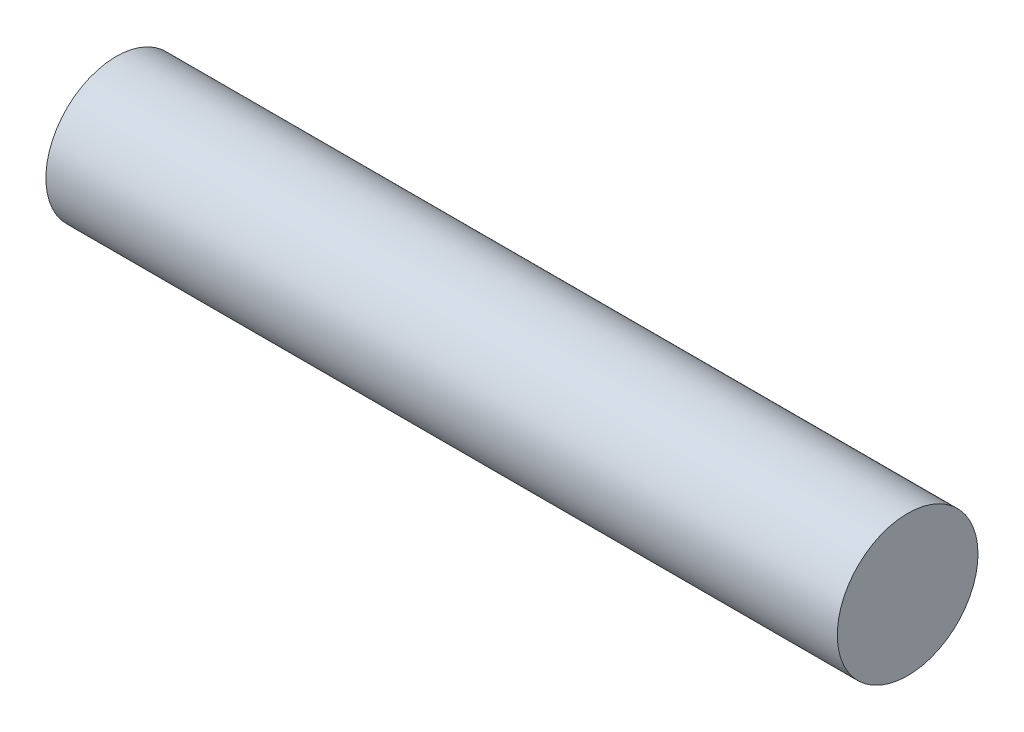
ISO-10303-21;
HEADER;
FILE_DESCRIPTION(('STEP AP214'),'2;1');
FILE_NAME('part.step','',(''),(''),'','','');
FILE_SCHEMA(('AUTOMOTIVE_DESIGN { 1 0 10303 214 1 1 1 1 }'));
ENDSEC;
DATA;
#1=APPLICATION_CONTEXT('core data for automotive mechanical design processes');
#2=APPLICATION_PROTOCOL_DEFINITION('international standard','automotive_design',2000,#1);
#3=PRODUCT_CONTEXT('',#1,'mechanical');
#4=PRODUCT('Part','Part','',(#3));
#5=PRODUCT_RELATED_PRODUCT_CATEGORY('part','',(#4));
#6=PRODUCT_DEFINITION_FORMATION('','',#4);
#7=PRODUCT_DEFINITION_CONTEXT('part definition',#1,'design');
#8=PRODUCT_DEFINITION('design','',#6,#7);
#9=PRODUCT_DEFINITION_SHAPE('','',#8);
#10=(LENGTH_UNIT() NAMED_UNIT(*) SI_UNIT(.MILLI.,.METRE.));
#11=(NAMED_UNIT(*) PLANE_ANGLE_UNIT() SI_UNIT($,.RADIAN.));
#12=(NAMED_UNIT(*) SI_UNIT($,.STERADIAN.) SOLID_ANGLE_UNIT());
#13=UNCERTAINTY_MEASURE_WITH_UNIT(LENGTH_MEASURE(1.E-05),#10,'distance_accuracy_value','');
#14=(GEOMETRIC_REPRESENTATION_CONTEXT(3) GLOBAL_UNCERTAINTY_ASSIGNED_CONTEXT((#13)) GLOBAL_UNIT_ASSIGNED_CONTEXT((#10,
#11,#12)) REPRESENTATION_CONTEXT('',''));
#15=CARTESIAN_POINT('',(0.,0.,0.));
#16=DIRECTION('',(0.,0.,1.));
#17=DIRECTION('',(1.,0.,0.));
#18=AXIS2_PLACEMENT_3D('',#15,#16,#17);
#19=CARTESIAN_POINT('',(9.,0.,0.));
#20=DIRECTION('',(-1.,0.,0.));
#21=DIRECTION('',(0.,0.,1.));
#22=AXIS2_PLACEMENT_3D('',#19,#20,#21);
#23=CYLINDRICAL_SURFACE('',#22,0.8);
#24=CARTESIAN_POINT('',(9.,0.,0.));
#25=DIRECTION('',(1.,0.,0.));
#26=DIRECTION('',(0.,0.,-1.));
#27=AXIS2_PLACEMENT_3D('',#24,#25,#26);
#28=CIRCLE('',#27,0.8);
#29=CARTESIAN_POINT('',(9.,0.,-0.8));
#30=VERTEX_POINT('',#29);
#31=EDGE_CURVE('E10',#30,#30,#28,.T.);
#32=ORIENTED_EDGE('',*,*,#31,.F.);
#33=EDGE_LOOP('',(#32));
#34=FACE_BOUND('',#33,.T.);
#35=CARTESIAN_POINT('',(0.,0.,0.));
#36=DIRECTION('',(1.,0.,0.));
#37=DIRECTION('',(0.,0.,-1.));
#38=AXIS2_PLACEMENT_3D('',#35,#36,#37);
#39=CIRCLE('',#38,0.8);
#40=CARTESIAN_POINT('',(0.,0.,-0.8));
#41=VERTEX_POINT('',#40);
#42=EDGE_CURVE('E43',#41,#41,#39,.T.);
#43=ORIENTED_EDGE('',*,*,#42,.T.);
#44=EDGE_LOOP('',(#43));
#45=FACE_BOUND('',#44,.T.);
#46=ADVANCED_FACE('F40',(#34,#45),#23,.T.);
#47=CARTESIAN_POINT('',(9.,0.,0.));
#48=DIRECTION('',(1.,0.,0.));
#49=DIRECTION('',(0.,0.,-1.));
#50=AXIS2_PLACEMENT_3D('',#47,#48,#49);
#51=PLANE('',#50);
#52=ORIENTED_EDGE('',*,*,#31,.T.);
#53=EDGE_LOOP('',(#52));
#54=FACE_BOUND('',#53,.T.);
#55=ADVANCED_FACE('F55',(#54),#51,.T.);
#56=CARTESIAN_POINT('',(0.,0.,0.));
#57=DIRECTION('',(1.,0.,0.));
#58=DIRECTION('',(0.,0.,-1.));
#59=AXIS2_PLACEMENT_3D('',#56,#57,#58);
#60=PLANE('',#59);
#61=ORIENTED_EDGE('',*,*,#42,.F.);
#62=EDGE_LOOP('',(#61));
#63=FACE_BOUND('',#62,.T.);
#64=ADVANCED_FACE('F53',(#63),#60,.F.);
#65=CLOSED_SHELL('',(#46,#55,#64));
#66=MANIFOLD_SOLID_BREP('B2',#65);
#67=ADVANCED_BREP_SHAPE_REPRESENTATION('',(#18,#66),#14);
#68=SHAPE_DEFINITION_REPRESENTATION(#9,#67);
ENDSEC;
END-ISO-10303-21;
